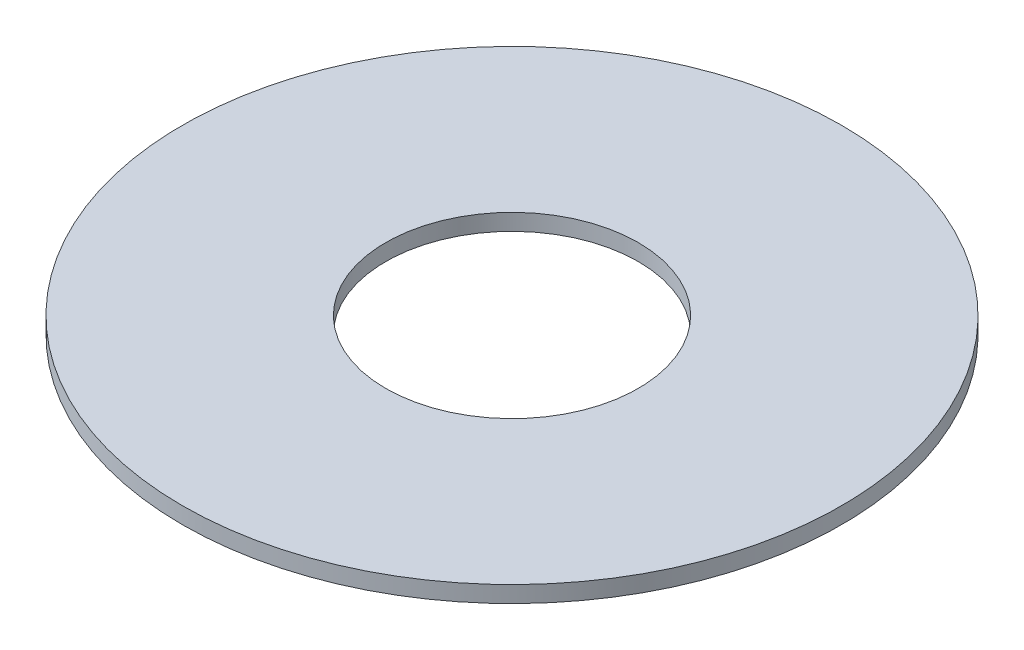
ISO-10303-21;
HEADER;
FILE_DESCRIPTION(('STEP AP214'),'2;1');
FILE_NAME('part.step','',(''),(''),'','','');
FILE_SCHEMA(('AUTOMOTIVE_DESIGN { 1 0 10303 214 1 1 1 1 }'));
ENDSEC;
DATA;
#1=APPLICATION_CONTEXT('core data for automotive mechanical design processes');
#2=APPLICATION_PROTOCOL_DEFINITION('international standard','automotive_design',2000,#1);
#3=PRODUCT_CONTEXT('',#1,'mechanical');
#4=PRODUCT('Part','Part','',(#3));
#5=PRODUCT_RELATED_PRODUCT_CATEGORY('part','',(#4));
#6=PRODUCT_DEFINITION_FORMATION('','',#4);
#7=PRODUCT_DEFINITION_CONTEXT('part definition',#1,'design');
#8=PRODUCT_DEFINITION('design','',#6,#7);
#9=PRODUCT_DEFINITION_SHAPE('','',#8);
#10=(LENGTH_UNIT() NAMED_UNIT(*) SI_UNIT(.MILLI.,.METRE.));
#11=(NAMED_UNIT(*) PLANE_ANGLE_UNIT() SI_UNIT($,.RADIAN.));
#12=(NAMED_UNIT(*) SI_UNIT($,.STERADIAN.) SOLID_ANGLE_UNIT());
#13=UNCERTAINTY_MEASURE_WITH_UNIT(LENGTH_MEASURE(1.E-05),#10,'distance_accuracy_value','');
#14=(GEOMETRIC_REPRESENTATION_CONTEXT(3) GLOBAL_UNCERTAINTY_ASSIGNED_CONTEXT((#13)) GLOBAL_UNIT_ASSIGNED_CONTEXT((#10,
#11,#12)) REPRESENTATION_CONTEXT('',''));
#15=CARTESIAN_POINT('',(0.,0.,0.));
#16=DIRECTION('',(0.,0.,1.));
#17=DIRECTION('',(1.,0.,0.));
#18=AXIS2_PLACEMENT_3D('',#15,#16,#17);
#19=CARTESIAN_POINT('',(0.,1.5,0.));
#20=DIRECTION('',(0.,1.,0.));
#21=DIRECTION('',(0.,0.,1.));
#22=AXIS2_PLACEMENT_3D('',#19,#20,#21);
#23=PLANE('',#22);
#24=CARTESIAN_POINT('',(0.,1.5,0.));
#25=DIRECTION('',(0.,1.,0.));
#26=DIRECTION('',(0.,0.,1.));
#27=AXIS2_PLACEMENT_3D('',#24,#25,#26);
#28=CIRCLE('',#27,30.);
#29=CARTESIAN_POINT('',(0.,1.5,30.));
#30=VERTEX_POINT('',#29);
#31=EDGE_CURVE('E10',#30,#30,#28,.T.);
#32=ORIENTED_EDGE('',*,*,#31,.T.);
#33=EDGE_LOOP('',(#32));
#34=FACE_BOUND('',#33,.T.);
#35=CARTESIAN_POINT('',(0.,1.5,0.));
#36=DIRECTION('',(0.,1.,0.));
#37=DIRECTION('',(0.,0.,1.));
#38=AXIS2_PLACEMENT_3D('',#35,#36,#37);
#39=CIRCLE('',#38,11.5);
#40=CARTESIAN_POINT('',(0.,1.5,11.5));
#41=VERTEX_POINT('',#40);
#42=EDGE_CURVE('E42',#41,#41,#39,.T.);
#43=ORIENTED_EDGE('',*,*,#42,.F.);
#44=EDGE_LOOP('',(#43));
#45=FACE_BOUND('',#44,.T.);
#46=ADVANCED_FACE('F31',(#34,#45),#23,.T.);
#47=CARTESIAN_POINT('',(0.,0.,0.));
#48=DIRECTION('',(0.,1.,0.));
#49=DIRECTION('',(0.,0.,1.));
#50=AXIS2_PLACEMENT_3D('',#47,#48,#49);
#51=PLANE('',#50);
#52=CARTESIAN_POINT('',(0.,0.,0.));
#53=DIRECTION('',(0.,1.,0.));
#54=DIRECTION('',(0.,0.,1.));
#55=AXIS2_PLACEMENT_3D('',#52,#53,#54);
#56=CIRCLE('',#55,30.);
#57=CARTESIAN_POINT('',(0.,0.,30.));
#58=VERTEX_POINT('',#57);
#59=EDGE_CURVE('E35',#58,#58,#56,.T.);
#60=ORIENTED_EDGE('',*,*,#59,.F.);
#61=EDGE_LOOP('',(#60));
#62=FACE_BOUND('',#61,.T.);
#63=CARTESIAN_POINT('',(0.,0.,0.));
#64=DIRECTION('',(0.,1.,0.));
#65=DIRECTION('',(0.,0.,1.));
#66=AXIS2_PLACEMENT_3D('',#63,#64,#65);
#67=CIRCLE('',#66,11.5);
#68=CARTESIAN_POINT('',(0.,0.,11.5));
#69=VERTEX_POINT('',#68);
#70=EDGE_CURVE('E44',#69,#69,#67,.T.);
#71=ORIENTED_EDGE('',*,*,#70,.T.);
#72=EDGE_LOOP('',(#71));
#73=FACE_BOUND('',#72,.T.);
#74=ADVANCED_FACE('F54',(#62,#73),#51,.F.);
#75=CARTESIAN_POINT('',(0.,1.5,0.));
#76=DIRECTION('',(0.,-1.,0.));
#77=DIRECTION('',(0.,0.,-1.));
#78=AXIS2_PLACEMENT_3D('',#75,#76,#77);
#79=CYLINDRICAL_SURFACE('',#78,30.);
#80=ORIENTED_EDGE('',*,*,#31,.F.);
#81=EDGE_LOOP('',(#80));
#82=FACE_BOUND('',#81,.T.);
#83=ORIENTED_EDGE('',*,*,#59,.T.);
#84=EDGE_LOOP('',(#83));
#85=FACE_BOUND('',#84,.T.);
#86=ADVANCED_FACE('F33',(#82,#85),#79,.T.);
#87=CARTESIAN_POINT('',(0.,1.5,0.));
#88=DIRECTION('',(0.,-1.,0.));
#89=DIRECTION('',(0.,0.,-1.));
#90=AXIS2_PLACEMENT_3D('',#87,#88,#89);
#91=CYLINDRICAL_SURFACE('',#90,11.5);
#92=ORIENTED_EDGE('',*,*,#42,.T.);
#93=EDGE_LOOP('',(#92));
#94=FACE_BOUND('',#93,.T.);
#95=ORIENTED_EDGE('',*,*,#70,.F.);
#96=EDGE_LOOP('',(#95));
#97=FACE_BOUND('',#96,.T.);
#98=ADVANCED_FACE('F50',(#94,#97),#91,.F.);
#99=CLOSED_SHELL('',(#46,#74,#86,#98));
#100=MANIFOLD_SOLID_BREP('B2',#99);
#101=ADVANCED_BREP_SHAPE_REPRESENTATION('',(#18,#100),#14);
#102=SHAPE_DEFINITION_REPRESENTATION(#9,#101);
ENDSEC;
END-ISO-10303-21;
